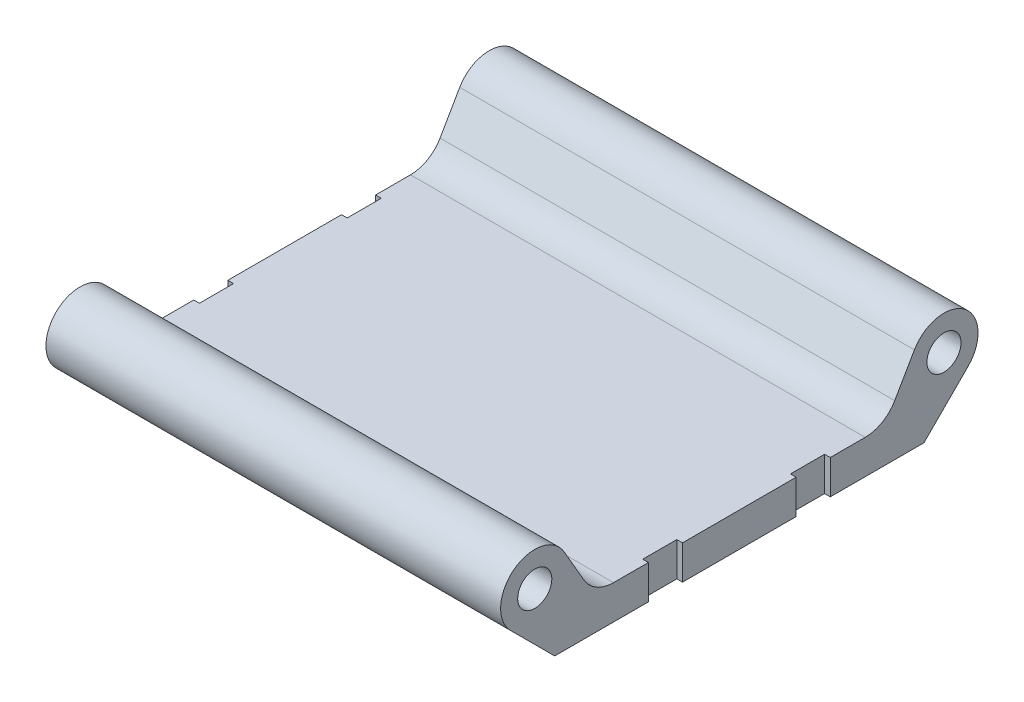
ISO-10303-21;
HEADER;
FILE_DESCRIPTION(('STEP AP214'),'2;1');
FILE_NAME('part.step','',(''),(''),'','','');
FILE_SCHEMA(('AUTOMOTIVE_DESIGN { 1 0 10303 214 1 1 1 1 }'));
ENDSEC;
DATA;
#1=APPLICATION_CONTEXT('core data for automotive mechanical design processes');
#2=APPLICATION_PROTOCOL_DEFINITION('international standard','automotive_design',2000,#1);
#3=PRODUCT_CONTEXT('',#1,'mechanical');
#4=PRODUCT('Part','Part','',(#3));
#5=PRODUCT_RELATED_PRODUCT_CATEGORY('part','',(#4));
#6=PRODUCT_DEFINITION_FORMATION('','',#4);
#7=PRODUCT_DEFINITION_CONTEXT('part definition',#1,'design');
#8=PRODUCT_DEFINITION('design','',#6,#7);
#9=PRODUCT_DEFINITION_SHAPE('','',#8);
#10=(LENGTH_UNIT() NAMED_UNIT(*) SI_UNIT(.MILLI.,.METRE.));
#11=(NAMED_UNIT(*) PLANE_ANGLE_UNIT() SI_UNIT($,.RADIAN.));
#12=(NAMED_UNIT(*) SI_UNIT($,.STERADIAN.) SOLID_ANGLE_UNIT());
#13=UNCERTAINTY_MEASURE_WITH_UNIT(LENGTH_MEASURE(1.E-05),#10,'distance_accuracy_value','');
#14=(GEOMETRIC_REPRESENTATION_CONTEXT(3) GLOBAL_UNCERTAINTY_ASSIGNED_CONTEXT((#13)) GLOBAL_UNIT_ASSIGNED_CONTEXT((#10,
#11,#12)) REPRESENTATION_CONTEXT('',''));
#15=CARTESIAN_POINT('',(0.,0.,0.));
#16=DIRECTION('',(0.,0.,1.));
#17=DIRECTION('',(1.,0.,0.));
#18=AXIS2_PLACEMENT_3D('',#15,#16,#17);
#19=CARTESIAN_POINT('',(40.,3.,12.8038475772933));
#20=DIRECTION('',(0.,-1.,0.));
#21=DIRECTION('',(0.,0.,-1.));
#22=AXIS2_PLACEMENT_3D('',#19,#20,#21);
#23=PLANE('',#22);
#24=DIRECTION('',(-1.,0.,0.));
#25=VECTOR('',#24,1.);
#26=CARTESIAN_POINT('',(40.,3.,8.));
#27=LINE('',#26,#25);
#28=CARTESIAN_POINT('',(40.,3.,8.));
#29=VERTEX_POINT('',#28);
#30=CARTESIAN_POINT('',(39.5,3.,7.99999999999999));
#31=VERTEX_POINT('',#30);
#32=EDGE_CURVE('E206',#29,#31,#27,.T.);
#33=ORIENTED_EDGE('',*,*,#32,.T.);
#34=DIRECTION('',(0.,0.,-1.));
#35=VECTOR('',#34,1.);
#36=CARTESIAN_POINT('',(39.5,3.,7.99999999999999));
#37=LINE('',#36,#35);
#38=CARTESIAN_POINT('',(39.5,3.,4.99999999999999));
#39=VERTEX_POINT('',#38);
#40=EDGE_CURVE('E217',#31,#39,#37,.T.);
#41=ORIENTED_EDGE('',*,*,#40,.T.);
#42=DIRECTION('',(-1.,0.,0.));
#43=VECTOR('',#42,1.);
#44=CARTESIAN_POINT('',(40.,3.,5.));
#45=LINE('',#44,#43);
#46=CARTESIAN_POINT('',(40.,3.,5.));
#47=VERTEX_POINT('',#46);
#48=EDGE_CURVE('E456',#47,#39,#45,.T.);
#49=ORIENTED_EDGE('',*,*,#48,.F.);
#50=DIRECTION('',(0.,0.,1.));
#51=VECTOR('',#50,1.);
#52=CARTESIAN_POINT('',(40.,3.,12.8038475772933));
#53=LINE('',#52,#51);
#54=CARTESIAN_POINT('',(40.,3.,-5.));
#55=VERTEX_POINT('',#54);
#56=EDGE_CURVE('E231',#55,#47,#53,.T.);
#57=ORIENTED_EDGE('',*,*,#56,.F.);
#58=DIRECTION('',(-1.,0.,0.));
#59=VECTOR('',#58,1.);
#60=CARTESIAN_POINT('',(0.,3.,-4.99999999999965));
#61=LINE('',#60,#59);
#62=CARTESIAN_POINT('',(39.5,3.,-4.99999999999999));
#63=VERTEX_POINT('',#62);
#64=EDGE_CURVE('E350',#55,#63,#61,.T.);
#65=ORIENTED_EDGE('',*,*,#64,.T.);
#66=DIRECTION('',(0.,0.,1.));
#67=VECTOR('',#66,1.);
#68=CARTESIAN_POINT('',(39.5,3.,0.));
#69=LINE('',#68,#67);
#70=CARTESIAN_POINT('',(39.5,3.,-7.99999999999999));
#71=VERTEX_POINT('',#70);
#72=EDGE_CURVE('E428',#71,#63,#69,.T.);
#73=ORIENTED_EDGE('',*,*,#72,.F.);
#74=DIRECTION('',(-1.,0.,0.));
#75=VECTOR('',#74,1.);
#76=CARTESIAN_POINT('',(0.,3.,-7.99999999999986));
#77=LINE('',#76,#75);
#78=CARTESIAN_POINT('',(40.,3.,-8.));
#79=VERTEX_POINT('',#78);
#80=EDGE_CURVE('E425',#79,#71,#77,.T.);
#81=ORIENTED_EDGE('',*,*,#80,.F.);
#82=CARTESIAN_POINT('',(40.,3.,-11.0717967697245));
#83=VERTEX_POINT('',#82);
#84=EDGE_CURVE('E234',#83,#79,#53,.T.);
#85=ORIENTED_EDGE('',*,*,#84,.F.);
#86=DIRECTION('',(-1.,0.,0.));
#87=VECTOR('',#86,1.);
#88=CARTESIAN_POINT('',(0.,3.,-11.0717967697245));
#89=LINE('',#88,#87);
#90=CARTESIAN_POINT('',(0.,3.,-11.0717967697245));
#91=VERTEX_POINT('',#90);
#92=EDGE_CURVE('E295',#83,#91,#89,.T.);
#93=ORIENTED_EDGE('',*,*,#92,.T.);
#94=DIRECTION('',(0.,0.,1.));
#95=VECTOR('',#94,1.);
#96=CARTESIAN_POINT('',(0.,3.,12.8038475772933));
#97=LINE('',#96,#95);
#98=CARTESIAN_POINT('',(0.,3.,-7.99999999999999));
#99=VERTEX_POINT('',#98);
#100=EDGE_CURVE('E261',#91,#99,#97,.T.);
#101=ORIENTED_EDGE('',*,*,#100,.T.);
#102=DIRECTION('',(1.,0.,0.));
#103=VECTOR('',#102,1.);
#104=CARTESIAN_POINT('',(0.,3.,-7.99999999999999));
#105=LINE('',#104,#103);
#106=CARTESIAN_POINT('',(0.5,3.,-7.99999999999999));
#107=VERTEX_POINT('',#106);
#108=EDGE_CURVE('E375',#99,#107,#105,.T.);
#109=ORIENTED_EDGE('',*,*,#108,.T.);
#110=DIRECTION('',(0.,0.,1.));
#111=VECTOR('',#110,1.);
#112=CARTESIAN_POINT('',(0.500000000000001,3.,0.));
#113=LINE('',#112,#111);
#114=CARTESIAN_POINT('',(0.500000000000001,3.,-4.99999999999999));
#115=VERTEX_POINT('',#114);
#116=EDGE_CURVE('E359',#107,#115,#113,.T.);
#117=ORIENTED_EDGE('',*,*,#116,.T.);
#118=DIRECTION('',(1.,0.,0.));
#119=VECTOR('',#118,1.);
#120=CARTESIAN_POINT('',(0.,3.,-4.99999999999999));
#121=LINE('',#120,#119);
#122=CARTESIAN_POINT('',(0.,3.,-4.99999999999999));
#123=VERTEX_POINT('',#122);
#124=EDGE_CURVE('E367',#123,#115,#121,.T.);
#125=ORIENTED_EDGE('',*,*,#124,.F.);
#126=CARTESIAN_POINT('',(0.,3.,5.));
#127=VERTEX_POINT('',#126);
#128=EDGE_CURVE('E265',#123,#127,#97,.T.);
#129=ORIENTED_EDGE('',*,*,#128,.T.);
#130=DIRECTION('',(1.,0.,0.));
#131=VECTOR('',#130,1.);
#132=CARTESIAN_POINT('',(0.,3.,5.));
#133=LINE('',#132,#131);
#134=CARTESIAN_POINT('',(0.500000000000007,3.,5.));
#135=VERTEX_POINT('',#134);
#136=EDGE_CURVE('E351',#127,#135,#133,.T.);
#137=ORIENTED_EDGE('',*,*,#136,.T.);
#138=DIRECTION('',(0.,0.,-1.));
#139=VECTOR('',#138,1.);
#140=CARTESIAN_POINT('',(0.500000000000007,3.,0.));
#141=LINE('',#140,#139);
#142=CARTESIAN_POINT('',(0.500000000000007,3.,8.));
#143=VERTEX_POINT('',#142);
#144=EDGE_CURVE('E354',#143,#135,#141,.T.);
#145=ORIENTED_EDGE('',*,*,#144,.F.);
#146=DIRECTION('',(1.,0.,0.));
#147=VECTOR('',#146,1.);
#148=CARTESIAN_POINT('',(0.,3.,8.));
#149=LINE('',#148,#147);
#150=CARTESIAN_POINT('',(0.,3.,8.));
#151=VERTEX_POINT('',#150);
#152=EDGE_CURVE('E358',#151,#143,#149,.T.);
#153=ORIENTED_EDGE('',*,*,#152,.F.);
#154=CARTESIAN_POINT('',(0.,3.,11.0717967697245));
#155=VERTEX_POINT('',#154);
#156=EDGE_CURVE('E260',#151,#155,#97,.T.);
#157=ORIENTED_EDGE('',*,*,#156,.T.);
#158=DIRECTION('',(-1.,0.,0.));
#159=VECTOR('',#158,1.);
#160=CARTESIAN_POINT('',(40.,3.,11.0717967697245));
#161=LINE('',#160,#159);
#162=CARTESIAN_POINT('',(40.,3.,11.0717967697245));
#163=VERTEX_POINT('',#162);
#164=EDGE_CURVE('E229',#155,#163,#161,.F.);
#165=ORIENTED_EDGE('',*,*,#164,.T.);
#166=EDGE_CURVE('E222',#29,#163,#53,.T.);
#167=ORIENTED_EDGE('',*,*,#166,.F.);
#168=EDGE_LOOP('',(#33,#41,#49,#57,#65,#73,#81,#85,#93,#101,#109,#117,#125,#129,#137,#145,#153,
#157,#165,#167));
#169=FACE_BOUND('',#168,.T.);
#170=ADVANCED_FACE('F33',(#169),#23,.F.);
#171=CARTESIAN_POINT('',(40.,0.,16.2426406871193));
#172=DIRECTION('',(0.,1.,0.));
#173=DIRECTION('',(0.,0.,1.));
#174=AXIS2_PLACEMENT_3D('',#171,#172,#173);
#175=PLANE('',#174);
#176=DIRECTION('',(-1.,0.,0.));
#177=VECTOR('',#176,1.);
#178=CARTESIAN_POINT('',(40.,0.,8.));
#179=LINE('',#178,#177);
#180=CARTESIAN_POINT('',(40.,0.,8.));
#181=VERTEX_POINT('',#180);
#182=CARTESIAN_POINT('',(39.5,0.,7.99999999999999));
#183=VERTEX_POINT('',#182);
#184=EDGE_CURVE('E454',#181,#183,#179,.T.);
#185=ORIENTED_EDGE('',*,*,#184,.F.);
#186=DIRECTION('',(0.,0.,-1.));
#187=VECTOR('',#186,1.);
#188=CARTESIAN_POINT('',(40.,0.,-16.2426406871193));
#189=LINE('',#188,#187);
#190=CARTESIAN_POINT('',(40.,0.,16.2426406871193));
#191=VERTEX_POINT('',#190);
#192=EDGE_CURVE('E225',#191,#181,#189,.T.);
#193=ORIENTED_EDGE('',*,*,#192,.F.);
#194=DIRECTION('',(-1.,0.,0.));
#195=VECTOR('',#194,1.);
#196=CARTESIAN_POINT('',(40.,0.,16.2426406871193));
#197=LINE('',#196,#195);
#198=CARTESIAN_POINT('',(0.,0.,16.2426406871193));
#199=VERTEX_POINT('',#198);
#200=EDGE_CURVE('E251',#191,#199,#197,.T.);
#201=ORIENTED_EDGE('',*,*,#200,.T.);
#202=DIRECTION('',(0.,0.,-1.));
#203=VECTOR('',#202,1.);
#204=CARTESIAN_POINT('',(0.,0.,16.2426406871193));
#205=LINE('',#204,#203);
#206=CARTESIAN_POINT('',(0.,0.,8.));
#207=VERTEX_POINT('',#206);
#208=EDGE_CURVE('E272',#199,#207,#205,.T.);
#209=ORIENTED_EDGE('',*,*,#208,.T.);
#210=DIRECTION('',(1.,0.,0.));
#211=VECTOR('',#210,1.);
#212=CARTESIAN_POINT('',(0.,0.,8.));
#213=LINE('',#212,#211);
#214=CARTESIAN_POINT('',(0.500000000000007,0.,8.));
#215=VERTEX_POINT('',#214);
#216=EDGE_CURVE('E355',#207,#215,#213,.T.);
#217=ORIENTED_EDGE('',*,*,#216,.T.);
#218=DIRECTION('',(0.,0.,-1.));
#219=VECTOR('',#218,1.);
#220=CARTESIAN_POINT('',(0.500000000000007,0.,0.));
#221=LINE('',#220,#219);
#222=CARTESIAN_POINT('',(0.500000000000007,0.,5.));
#223=VERTEX_POINT('',#222);
#224=EDGE_CURVE('E338',#215,#223,#221,.T.);
#225=ORIENTED_EDGE('',*,*,#224,.T.);
#226=DIRECTION('',(1.,0.,0.));
#227=VECTOR('',#226,1.);
#228=CARTESIAN_POINT('',(0.,0.,5.));
#229=LINE('',#228,#227);
#230=CARTESIAN_POINT('',(0.,0.,5.));
#231=VERTEX_POINT('',#230);
#232=EDGE_CURVE('E335',#231,#223,#229,.T.);
#233=ORIENTED_EDGE('',*,*,#232,.F.);
#234=CARTESIAN_POINT('',(0.,0.,-4.99999999999999));
#235=VERTEX_POINT('',#234);
#236=EDGE_CURVE('E276',#231,#235,#205,.T.);
#237=ORIENTED_EDGE('',*,*,#236,.T.);
#238=DIRECTION('',(1.,0.,0.));
#239=VECTOR('',#238,1.);
#240=CARTESIAN_POINT('',(0.,0.,-4.99999999999999));
#241=LINE('',#240,#239);
#242=CARTESIAN_POINT('',(0.500000000000001,0.,-4.99999999999999));
#243=VERTEX_POINT('',#242);
#244=EDGE_CURVE('E369',#235,#243,#241,.T.);
#245=ORIENTED_EDGE('',*,*,#244,.T.);
#246=DIRECTION('',(0.,0.,1.));
#247=VECTOR('',#246,1.);
#248=CARTESIAN_POINT('',(0.500000000000001,0.,0.));
#249=LINE('',#248,#247);
#250=CARTESIAN_POINT('',(0.5,0.,-7.99999999999999));
#251=VERTEX_POINT('',#250);
#252=EDGE_CURVE('E364',#251,#243,#249,.T.);
#253=ORIENTED_EDGE('',*,*,#252,.F.);
#254=DIRECTION('',(1.,0.,0.));
#255=VECTOR('',#254,1.);
#256=CARTESIAN_POINT('',(0.,0.,-7.99999999999999));
#257=LINE('',#256,#255);
#258=CARTESIAN_POINT('',(0.,0.,-7.99999999999999));
#259=VERTEX_POINT('',#258);
#260=EDGE_CURVE('E366',#259,#251,#257,.T.);
#261=ORIENTED_EDGE('',*,*,#260,.F.);
#262=CARTESIAN_POINT('',(0.,0.,-16.2426406871193));
#263=VERTEX_POINT('',#262);
#264=EDGE_CURVE('E271',#259,#263,#205,.T.);
#265=ORIENTED_EDGE('',*,*,#264,.T.);
#266=DIRECTION('',(-1.,0.,0.));
#267=VECTOR('',#266,1.);
#268=CARTESIAN_POINT('',(40.,0.,-16.2426406871193));
#269=LINE('',#268,#267);
#270=CARTESIAN_POINT('',(40.,0.,-16.2426406871193));
#271=VERTEX_POINT('',#270);
#272=EDGE_CURVE('E291',#271,#263,#269,.T.);
#273=ORIENTED_EDGE('',*,*,#272,.F.);
#274=CARTESIAN_POINT('',(40.,0.,-8.));
#275=VERTEX_POINT('',#274);
#276=EDGE_CURVE('E275',#275,#271,#189,.T.);
#277=ORIENTED_EDGE('',*,*,#276,.F.);
#278=DIRECTION('',(-1.,0.,0.));
#279=VECTOR('',#278,1.);
#280=CARTESIAN_POINT('',(0.,0.,-7.99999999999986));
#281=LINE('',#280,#279);
#282=CARTESIAN_POINT('',(39.5,0.,-7.99999999999999));
#283=VERTEX_POINT('',#282);
#284=EDGE_CURVE('E56',#275,#283,#281,.T.);
#285=ORIENTED_EDGE('',*,*,#284,.T.);
#286=DIRECTION('',(0.,0.,1.));
#287=VECTOR('',#286,1.);
#288=CARTESIAN_POINT('',(39.5,0.,0.));
#289=LINE('',#288,#287);
#290=CARTESIAN_POINT('',(39.5,0.,-4.99999999999999));
#291=VERTEX_POINT('',#290);
#292=EDGE_CURVE('E434',#283,#291,#289,.T.);
#293=ORIENTED_EDGE('',*,*,#292,.T.);
#294=DIRECTION('',(-1.,0.,0.));
#295=VECTOR('',#294,1.);
#296=CARTESIAN_POINT('',(0.,0.,-4.99999999999965));
#297=LINE('',#296,#295);
#298=CARTESIAN_POINT('',(40.,0.,-5.));
#299=VERTEX_POINT('',#298);
#300=EDGE_CURVE('E343',#299,#291,#297,.T.);
#301=ORIENTED_EDGE('',*,*,#300,.F.);
#302=CARTESIAN_POINT('',(40.,0.,4.99999999999999));
#303=VERTEX_POINT('',#302);
#304=EDGE_CURVE('E401',#303,#299,#189,.T.);
#305=ORIENTED_EDGE('',*,*,#304,.F.);
#306=DIRECTION('',(-1.,0.,0.));
#307=VECTOR('',#306,1.);
#308=CARTESIAN_POINT('',(40.,0.,5.));
#309=LINE('',#308,#307);
#310=CARTESIAN_POINT('',(39.5,0.,4.99999999999999));
#311=VERTEX_POINT('',#310);
#312=EDGE_CURVE('E48',#303,#311,#309,.T.);
#313=ORIENTED_EDGE('',*,*,#312,.T.);
#314=DIRECTION('',(0.,0.,-1.));
#315=VECTOR('',#314,1.);
#316=CARTESIAN_POINT('',(39.5,0.,7.99999999999999));
#317=LINE('',#316,#315);
#318=EDGE_CURVE('E457',#183,#311,#317,.T.);
#319=ORIENTED_EDGE('',*,*,#318,.F.);
#320=EDGE_LOOP('',(#185,#193,#201,#209,#217,#225,#233,#237,#245,#253,#261,#265,#273,#277,#285,
#293,#301,#305,#313,#319));
#321=FACE_BOUND('',#320,.T.);
#322=ADVANCED_FACE('F329',(#321),#175,.F.);
#323=CARTESIAN_POINT('',(40.,6.,18.));
#324=DIRECTION('',(1.,0.,0.));
#325=DIRECTION('',(0.,0.,-1.));
#326=AXIS2_PLACEMENT_3D('',#323,#324,#325);
#327=PLANE('',#326);
#328=CARTESIAN_POINT('',(40.,6.,18.));
#329=DIRECTION('',(1.,0.,0.));
#330=DIRECTION('',(0.,0.,1.));
#331=AXIS2_PLACEMENT_3D('',#328,#329,#330);
#332=CIRCLE('',#331,1.5);
#333=CARTESIAN_POINT('',(40.,6.,19.5));
#334=VERTEX_POINT('',#333);
#335=EDGE_CURVE('E389',#334,#334,#332,.T.);
#336=ORIENTED_EDGE('',*,*,#335,.F.);
#337=EDGE_LOOP('',(#336));
#338=FACE_BOUND('',#337,.T.);
#339=ORIENTED_EDGE('',*,*,#192,.T.);
#340=DIRECTION('',(0.,1.,0.));
#341=VECTOR('',#340,1.);
#342=CARTESIAN_POINT('',(40.,0.,8.));
#343=LINE('',#342,#341);
#344=EDGE_CURVE('E209',#181,#29,#343,.T.);
#345=ORIENTED_EDGE('',*,*,#344,.T.);
#346=ORIENTED_EDGE('',*,*,#166,.T.);
#347=CARTESIAN_POINT('',(40.,6.,11.0717967697245));
#348=DIRECTION('',(1.,0.,0.));
#349=DIRECTION('',(0.,0.,-1.));
#350=AXIS2_PLACEMENT_3D('',#347,#348,#349);
#351=CIRCLE('',#350,3.);
#352=CARTESIAN_POINT('',(40.,4.49999999999999,13.6698729810778));
#353=VERTEX_POINT('',#352);
#354=EDGE_CURVE('E11',#163,#353,#351,.F.);
#355=ORIENTED_EDGE('',*,*,#354,.T.);
#356=DIRECTION('',(0.,0.866025403784436,0.500000000000005));
#357=VECTOR('',#356,1.);
#358=CARTESIAN_POINT('',(40.,7.50000000000001,15.4019237886467));
#359=LINE('',#358,#357);
#360=CARTESIAN_POINT('',(40.,7.50000000000001,15.4019237886467));
#361=VERTEX_POINT('',#360);
#362=EDGE_CURVE('E241',#353,#361,#359,.T.);
#363=ORIENTED_EDGE('',*,*,#362,.T.);
#364=CARTESIAN_POINT('',(40.,6.,18.));
#365=DIRECTION('',(1.,0.,0.));
#366=DIRECTION('',(0.,0.,-1.));
#367=AXIS2_PLACEMENT_3D('',#364,#365,#366);
#368=CIRCLE('',#367,3.);
#369=CARTESIAN_POINT('',(40.,3.87867965644037,20.1213203435596));
#370=VERTEX_POINT('',#369);
#371=EDGE_CURVE('E244',#361,#370,#368,.T.);
#372=ORIENTED_EDGE('',*,*,#371,.T.);
#373=DIRECTION('',(0.,-0.707106781186549,-0.707106781186546));
#374=VECTOR('',#373,1.);
#375=CARTESIAN_POINT('',(40.,3.87867965644037,20.1213203435596));
#376=LINE('',#375,#374);
#377=EDGE_CURVE('E247',#370,#191,#376,.T.);
#378=ORIENTED_EDGE('',*,*,#377,.T.);
#379=EDGE_LOOP('',(#339,#345,#346,#355,#363,#372,#378));
#380=FACE_BOUND('',#379,.T.);
#381=ADVANCED_FACE('F221',(#338,#380),#327,.T.);
#382=DIRECTION('',(0.,1.,0.));
#383=VECTOR('',#382,1.);
#384=CARTESIAN_POINT('',(40.,0.,5.));
#385=LINE('',#384,#383);
#386=EDGE_CURVE('E226',#303,#47,#385,.T.);
#387=ORIENTED_EDGE('',*,*,#386,.F.);
#388=ORIENTED_EDGE('',*,*,#304,.T.);
#389=DIRECTION('',(0.,1.,0.));
#390=VECTOR('',#389,1.);
#391=CARTESIAN_POINT('',(40.,0.,-5.));
#392=LINE('',#391,#390);
#393=EDGE_CURVE('E436',#299,#55,#392,.T.);
#394=ORIENTED_EDGE('',*,*,#393,.T.);
#395=ORIENTED_EDGE('',*,*,#56,.T.);
#396=EDGE_LOOP('',(#387,#388,#394,#395));
#397=FACE_BOUND('',#396,.T.);
#398=ADVANCED_FACE('F473',(#397),#327,.T.);
#399=CARTESIAN_POINT('',(0.,6.,18.));
#400=DIRECTION('',(1.,0.,0.));
#401=DIRECTION('',(0.,0.,-1.));
#402=AXIS2_PLACEMENT_3D('',#399,#400,#401);
#403=PLANE('',#402);
#404=DIRECTION('',(0.,1.,0.));
#405=VECTOR('',#404,1.);
#406=CARTESIAN_POINT('',(0.,0.,5.));
#407=LINE('',#406,#405);
#408=EDGE_CURVE('E347',#231,#127,#407,.T.);
#409=ORIENTED_EDGE('',*,*,#408,.T.);
#410=ORIENTED_EDGE('',*,*,#128,.F.);
#411=DIRECTION('',(0.,1.,0.));
#412=VECTOR('',#411,1.);
#413=CARTESIAN_POINT('',(0.,0.,-4.99999999999999));
#414=LINE('',#413,#412);
#415=EDGE_CURVE('E383',#235,#123,#414,.T.);
#416=ORIENTED_EDGE('',*,*,#415,.F.);
#417=ORIENTED_EDGE('',*,*,#236,.F.);
#418=EDGE_LOOP('',(#409,#410,#416,#417));
#419=FACE_BOUND('',#418,.T.);
#420=ADVANCED_FACE('F498',(#419),#403,.F.);
#421=CARTESIAN_POINT('',(0.,6.,-18.));
#422=DIRECTION('',(1.,0.,0.));
#423=DIRECTION('',(0.,0.,-1.));
#424=AXIS2_PLACEMENT_3D('',#421,#422,#423);
#425=CIRCLE('',#424,1.5);
#426=CARTESIAN_POINT('',(0.,6.,-19.5));
#427=VERTEX_POINT('',#426);
#428=EDGE_CURVE('E392',#427,#427,#425,.T.);
#429=ORIENTED_EDGE('',*,*,#428,.T.);
#430=EDGE_LOOP('',(#429));
#431=FACE_BOUND('',#430,.T.);
#432=DIRECTION('',(0.,1.,0.));
#433=VECTOR('',#432,1.);
#434=CARTESIAN_POINT('',(0.,0.,-7.99999999999999));
#435=LINE('',#434,#433);
#436=EDGE_CURVE('E385',#259,#99,#435,.T.);
#437=ORIENTED_EDGE('',*,*,#436,.T.);
#438=ORIENTED_EDGE('',*,*,#100,.F.);
#439=CARTESIAN_POINT('',(0.,6.,-11.0717967697245));
#440=DIRECTION('',(1.,0.,0.));
#441=DIRECTION('',(0.,0.,-1.));
#442=AXIS2_PLACEMENT_3D('',#439,#440,#441);
#443=CIRCLE('',#442,3.);
#444=CARTESIAN_POINT('',(0.,4.49999999999999,-13.6698729810778));
#445=VERTEX_POINT('',#444);
#446=EDGE_CURVE('E303',#91,#445,#443,.T.);
#447=ORIENTED_EDGE('',*,*,#446,.T.);
#448=DIRECTION('',(0.,-0.866025403784436,0.500000000000005));
#449=VECTOR('',#448,1.);
#450=CARTESIAN_POINT('',(0.,7.50000000000001,-15.4019237886467));
#451=LINE('',#450,#449);
#452=CARTESIAN_POINT('',(0.,7.50000000000001,-15.4019237886467));
#453=VERTEX_POINT('',#452);
#454=EDGE_CURVE('E257',#453,#445,#451,.T.);
#455=ORIENTED_EDGE('',*,*,#454,.F.);
#456=CARTESIAN_POINT('',(0.,6.,-18.));
#457=DIRECTION('',(1.,0.,0.));
#458=DIRECTION('',(0.,0.,1.));
#459=AXIS2_PLACEMENT_3D('',#456,#457,#458);
#460=CIRCLE('',#459,3.);
#461=CARTESIAN_POINT('',(0.,3.87867965644036,-20.1213203435596));
#462=VERTEX_POINT('',#461);
#463=EDGE_CURVE('E254',#462,#453,#460,.T.);
#464=ORIENTED_EDGE('',*,*,#463,.F.);
#465=DIRECTION('',(0.,0.707106781186549,-0.707106781186546));
#466=VECTOR('',#465,1.);
#467=CARTESIAN_POINT('',(0.,3.87867965644037,-20.1213203435596));
#468=LINE('',#467,#466);
#469=EDGE_CURVE('E252',#263,#462,#468,.T.);
#470=ORIENTED_EDGE('',*,*,#469,.F.);
#471=ORIENTED_EDGE('',*,*,#264,.F.);
#472=EDGE_LOOP('',(#437,#438,#447,#455,#464,#470,#471));
#473=FACE_BOUND('',#472,.T.);
#474=ADVANCED_FACE('F482',(#431,#473),#403,.F.);
#475=DIRECTION('',(0.,1.,0.));
#476=VECTOR('',#475,1.);
#477=CARTESIAN_POINT('',(40.,0.,-8.));
#478=LINE('',#477,#476);
#479=EDGE_CURVE('E449',#275,#79,#478,.T.);
#480=ORIENTED_EDGE('',*,*,#479,.F.);
#481=ORIENTED_EDGE('',*,*,#276,.T.);
#482=DIRECTION('',(0.,0.707106781186549,-0.707106781186546));
#483=VECTOR('',#482,1.);
#484=CARTESIAN_POINT('',(40.,3.87867965644037,-20.1213203435596));
#485=LINE('',#484,#483);
#486=CARTESIAN_POINT('',(40.,3.87867965644036,-20.1213203435596));
#487=VERTEX_POINT('',#486);
#488=EDGE_CURVE('E400',#271,#487,#485,.T.);
#489=ORIENTED_EDGE('',*,*,#488,.T.);
#490=CARTESIAN_POINT('',(40.,6.,-18.));
#491=DIRECTION('',(1.,0.,0.));
#492=DIRECTION('',(0.,0.,1.));
#493=AXIS2_PLACEMENT_3D('',#490,#491,#492);
#494=CIRCLE('',#493,3.);
#495=CARTESIAN_POINT('',(40.,7.50000000000001,-15.4019237886467));
#496=VERTEX_POINT('',#495);
#497=EDGE_CURVE('E237',#487,#496,#494,.T.);
#498=ORIENTED_EDGE('',*,*,#497,.T.);
#499=DIRECTION('',(0.,-0.866025403784436,0.500000000000005));
#500=VECTOR('',#499,1.);
#501=CARTESIAN_POINT('',(40.,7.50000000000001,-15.4019237886467));
#502=LINE('',#501,#500);
#503=CARTESIAN_POINT('',(40.,4.49999999999999,-13.6698729810778));
#504=VERTEX_POINT('',#503);
#505=EDGE_CURVE('E232',#496,#504,#502,.T.);
#506=ORIENTED_EDGE('',*,*,#505,.T.);
#507=CARTESIAN_POINT('',(40.,6.,-11.0717967697245));
#508=DIRECTION('',(1.,0.,0.));
#509=DIRECTION('',(0.,0.,-1.));
#510=AXIS2_PLACEMENT_3D('',#507,#508,#509);
#511=CIRCLE('',#510,3.);
#512=EDGE_CURVE('E305',#504,#83,#511,.F.);
#513=ORIENTED_EDGE('',*,*,#512,.T.);
#514=ORIENTED_EDGE('',*,*,#84,.T.);
#515=EDGE_LOOP('',(#480,#481,#489,#498,#506,#513,#514));
#516=FACE_BOUND('',#515,.T.);
#517=CARTESIAN_POINT('',(40.,6.,-18.));
#518=DIRECTION('',(1.,0.,0.));
#519=DIRECTION('',(0.,0.,-1.));
#520=AXIS2_PLACEMENT_3D('',#517,#518,#519);
#521=CIRCLE('',#520,1.5);
#522=CARTESIAN_POINT('',(40.,6.,-19.5));
#523=VERTEX_POINT('',#522);
#524=EDGE_CURVE('E255',#523,#523,#521,.T.);
#525=ORIENTED_EDGE('',*,*,#524,.F.);
#526=EDGE_LOOP('',(#525));
#527=FACE_BOUND('',#526,.T.);
#528=ADVANCED_FACE('F405',(#516,#527),#327,.T.);
#529=ORIENTED_EDGE('',*,*,#156,.F.);
#530=DIRECTION('',(0.,1.,0.));
#531=VECTOR('',#530,1.);
#532=CARTESIAN_POINT('',(0.,0.,8.));
#533=LINE('',#532,#531);
#534=EDGE_CURVE('E331',#207,#151,#533,.T.);
#535=ORIENTED_EDGE('',*,*,#534,.F.);
#536=ORIENTED_EDGE('',*,*,#208,.F.);
#537=DIRECTION('',(0.,-0.707106781186549,-0.707106781186546));
#538=VECTOR('',#537,1.);
#539=CARTESIAN_POINT('',(0.,3.87867965644037,20.1213203435596));
#540=LINE('',#539,#538);
#541=CARTESIAN_POINT('',(0.,3.87867965644037,20.1213203435596));
#542=VERTEX_POINT('',#541);
#543=EDGE_CURVE('E269',#542,#199,#540,.T.);
#544=ORIENTED_EDGE('',*,*,#543,.F.);
#545=CARTESIAN_POINT('',(0.,6.,18.));
#546=DIRECTION('',(1.,0.,0.));
#547=DIRECTION('',(0.,0.,-1.));
#548=AXIS2_PLACEMENT_3D('',#545,#546,#547);
#549=CIRCLE('',#548,3.);
#550=CARTESIAN_POINT('',(0.,7.50000000000001,15.4019237886467));
#551=VERTEX_POINT('',#550);
#552=EDGE_CURVE('E267',#551,#542,#549,.T.);
#553=ORIENTED_EDGE('',*,*,#552,.F.);
#554=DIRECTION('',(0.,0.866025403784436,0.500000000000005));
#555=VECTOR('',#554,1.);
#556=CARTESIAN_POINT('',(0.,7.50000000000001,15.4019237886467));
#557=LINE('',#556,#555);
#558=CARTESIAN_POINT('',(0.,4.49999999999999,13.6698729810778));
#559=VERTEX_POINT('',#558);
#560=EDGE_CURVE('E264',#559,#551,#557,.T.);
#561=ORIENTED_EDGE('',*,*,#560,.F.);
#562=CARTESIAN_POINT('',(0.,6.,11.0717967697245));
#563=DIRECTION('',(1.,0.,0.));
#564=DIRECTION('',(0.,0.,-1.));
#565=AXIS2_PLACEMENT_3D('',#562,#563,#564);
#566=CIRCLE('',#565,3.);
#567=EDGE_CURVE('E41',#559,#155,#566,.T.);
#568=ORIENTED_EDGE('',*,*,#567,.T.);
#569=EDGE_LOOP('',(#529,#535,#536,#544,#553,#561,#568));
#570=FACE_BOUND('',#569,.T.);
#571=CARTESIAN_POINT('',(0.,6.,18.));
#572=DIRECTION('',(1.,0.,0.));
#573=DIRECTION('',(0.,0.,1.));
#574=AXIS2_PLACEMENT_3D('',#571,#572,#573);
#575=CIRCLE('',#574,1.5);
#576=CARTESIAN_POINT('',(0.,6.,19.5));
#577=VERTEX_POINT('',#576);
#578=EDGE_CURVE('E382',#577,#577,#575,.T.);
#579=ORIENTED_EDGE('',*,*,#578,.T.);
#580=EDGE_LOOP('',(#579));
#581=FACE_BOUND('',#580,.T.);
#582=ADVANCED_FACE('F310',(#570,#581),#403,.F.);
#583=CARTESIAN_POINT('',(40.,3.87867965644037,-20.1213203435596));
#584=DIRECTION('',(0.,0.707106781186546,0.707106781186549));
#585=DIRECTION('',(0.,-0.707106781186549,0.707106781186546));
#586=AXIS2_PLACEMENT_3D('',#583,#584,#585);
#587=PLANE('',#586);
#588=ORIENTED_EDGE('',*,*,#469,.T.);
#589=DIRECTION('',(-1.,0.,0.));
#590=VECTOR('',#589,1.);
#591=CARTESIAN_POINT('',(40.,3.87867965644036,-20.1213203435596));
#592=LINE('',#591,#590);
#593=EDGE_CURVE('E288',#487,#462,#592,.T.);
#594=ORIENTED_EDGE('',*,*,#593,.F.);
#595=ORIENTED_EDGE('',*,*,#488,.F.);
#596=ORIENTED_EDGE('',*,*,#272,.T.);
#597=EDGE_LOOP('',(#588,#594,#595,#596));
#598=FACE_BOUND('',#597,.T.);
#599=ADVANCED_FACE('F476',(#598),#587,.F.);
#600=CARTESIAN_POINT('',(40.,6.,-18.));
#601=DIRECTION('',(-1.,0.,0.));
#602=DIRECTION('',(0.,0.,1.));
#603=AXIS2_PLACEMENT_3D('',#600,#601,#602);
#604=CYLINDRICAL_SURFACE('',#603,3.);
#605=ORIENTED_EDGE('',*,*,#463,.T.);
#606=DIRECTION('',(-1.,0.,0.));
#607=VECTOR('',#606,1.);
#608=CARTESIAN_POINT('',(40.,7.50000000000001,-15.4019237886467));
#609=LINE('',#608,#607);
#610=EDGE_CURVE('E285',#496,#453,#609,.T.);
#611=ORIENTED_EDGE('',*,*,#610,.F.);
#612=ORIENTED_EDGE('',*,*,#497,.F.);
#613=ORIENTED_EDGE('',*,*,#593,.T.);
#614=EDGE_LOOP('',(#605,#611,#612,#613));
#615=FACE_BOUND('',#614,.T.);
#616=ADVANCED_FACE('F412',(#615),#604,.T.);
#617=CARTESIAN_POINT('',(40.,7.50000000000001,-15.4019237886467));
#618=DIRECTION('',(0.,-0.500000000000005,-0.866025403784436));
#619=DIRECTION('',(0.,0.866025403784436,-0.500000000000005));
#620=AXIS2_PLACEMENT_3D('',#617,#618,#619);
#621=PLANE('',#620);
#622=ORIENTED_EDGE('',*,*,#454,.T.);
#623=DIRECTION('',(-1.,0.,0.));
#624=VECTOR('',#623,1.);
#625=CARTESIAN_POINT('',(40.,4.49999999999999,-13.6698729810778));
#626=LINE('',#625,#624);
#627=EDGE_CURVE('E298',#445,#504,#626,.F.);
#628=ORIENTED_EDGE('',*,*,#627,.T.);
#629=ORIENTED_EDGE('',*,*,#505,.F.);
#630=ORIENTED_EDGE('',*,*,#610,.T.);
#631=EDGE_LOOP('',(#622,#628,#629,#630));
#632=FACE_BOUND('',#631,.T.);
#633=ADVANCED_FACE('F416',(#632),#621,.F.);
#634=CARTESIAN_POINT('',(40.,7.50000000000001,15.4019237886467));
#635=DIRECTION('',(0.,-0.500000000000005,0.866025403784436));
#636=DIRECTION('',(0.,-0.866025403784436,-0.500000000000005));
#637=AXIS2_PLACEMENT_3D('',#634,#635,#636);
#638=PLANE('',#637);
#639=ORIENTED_EDGE('',*,*,#362,.F.);
#640=DIRECTION('',(-1.,0.,0.));
#641=VECTOR('',#640,1.);
#642=CARTESIAN_POINT('',(0.,4.49999999999999,13.6698729810778));
#643=LINE('',#642,#641);
#644=EDGE_CURVE('E300',#353,#559,#643,.T.);
#645=ORIENTED_EDGE('',*,*,#644,.T.);
#646=ORIENTED_EDGE('',*,*,#560,.T.);
#647=DIRECTION('',(-1.,0.,0.));
#648=VECTOR('',#647,1.);
#649=CARTESIAN_POINT('',(40.,7.50000000000001,15.4019237886467));
#650=LINE('',#649,#648);
#651=EDGE_CURVE('E282',#361,#551,#650,.T.);
#652=ORIENTED_EDGE('',*,*,#651,.F.);
#653=EDGE_LOOP('',(#639,#645,#646,#652));
#654=FACE_BOUND('',#653,.T.);
#655=ADVANCED_FACE('F317',(#654),#638,.F.);
#656=CARTESIAN_POINT('',(40.,6.,18.));
#657=DIRECTION('',(-1.,0.,0.));
#658=DIRECTION('',(0.,0.,1.));
#659=AXIS2_PLACEMENT_3D('',#656,#657,#658);
#660=CYLINDRICAL_SURFACE('',#659,3.);
#661=ORIENTED_EDGE('',*,*,#552,.T.);
#662=DIRECTION('',(-1.,0.,0.));
#663=VECTOR('',#662,1.);
#664=CARTESIAN_POINT('',(40.,3.87867965644037,20.1213203435596));
#665=LINE('',#664,#663);
#666=EDGE_CURVE('E279',#370,#542,#665,.T.);
#667=ORIENTED_EDGE('',*,*,#666,.F.);
#668=ORIENTED_EDGE('',*,*,#371,.F.);
#669=ORIENTED_EDGE('',*,*,#651,.T.);
#670=EDGE_LOOP('',(#661,#667,#668,#669));
#671=FACE_BOUND('',#670,.T.);
#672=ADVANCED_FACE('F321',(#671),#660,.T.);
#673=CARTESIAN_POINT('',(40.,3.87867965644037,20.1213203435596));
#674=DIRECTION('',(0.,0.707106781186546,-0.707106781186549));
#675=DIRECTION('',(0.,0.707106781186549,0.707106781186546));
#676=AXIS2_PLACEMENT_3D('',#673,#674,#675);
#677=PLANE('',#676);
#678=ORIENTED_EDGE('',*,*,#543,.T.);
#679=ORIENTED_EDGE('',*,*,#200,.F.);
#680=ORIENTED_EDGE('',*,*,#377,.F.);
#681=ORIENTED_EDGE('',*,*,#666,.T.);
#682=EDGE_LOOP('',(#678,#679,#680,#681));
#683=FACE_BOUND('',#682,.T.);
#684=ADVANCED_FACE('F325',(#683),#677,.F.);
#685=CARTESIAN_POINT('',(40.,6.,-18.));
#686=DIRECTION('',(-1.,0.,0.));
#687=DIRECTION('',(0.,0.,1.));
#688=AXIS2_PLACEMENT_3D('',#685,#686,#687);
#689=CYLINDRICAL_SURFACE('',#688,1.5);
#690=ORIENTED_EDGE('',*,*,#524,.T.);
#691=EDGE_LOOP('',(#690));
#692=FACE_BOUND('',#691,.T.);
#693=ORIENTED_EDGE('',*,*,#428,.F.);
#694=EDGE_LOOP('',(#693));
#695=FACE_BOUND('',#694,.T.);
#696=ADVANCED_FACE('F539',(#692,#695),#689,.F.);
#697=CARTESIAN_POINT('',(40.,6.,18.));
#698=DIRECTION('',(-1.,0.,0.));
#699=DIRECTION('',(0.,0.,1.));
#700=AXIS2_PLACEMENT_3D('',#697,#698,#699);
#701=CYLINDRICAL_SURFACE('',#700,1.5);
#702=ORIENTED_EDGE('',*,*,#335,.T.);
#703=EDGE_LOOP('',(#702));
#704=FACE_BOUND('',#703,.T.);
#705=ORIENTED_EDGE('',*,*,#578,.F.);
#706=EDGE_LOOP('',(#705));
#707=FACE_BOUND('',#706,.T.);
#708=ADVANCED_FACE('F534',(#704,#707),#701,.F.);
#709=CARTESIAN_POINT('',(40.,6.,-11.0717967697245));
#710=DIRECTION('',(1.,0.,0.));
#711=DIRECTION('',(0.,0.,-1.));
#712=AXIS2_PLACEMENT_3D('',#709,#710,#711);
#713=CYLINDRICAL_SURFACE('',#712,3.);
#714=ORIENTED_EDGE('',*,*,#512,.F.);
#715=ORIENTED_EDGE('',*,*,#627,.F.);
#716=ORIENTED_EDGE('',*,*,#446,.F.);
#717=ORIENTED_EDGE('',*,*,#92,.F.);
#718=EDGE_LOOP('',(#714,#715,#716,#717));
#719=FACE_BOUND('',#718,.T.);
#720=ADVANCED_FACE('F419',(#719),#713,.F.);
#721=CARTESIAN_POINT('',(40.,6.,11.0717967697245));
#722=DIRECTION('',(1.,0.,0.));
#723=DIRECTION('',(0.,0.,-1.));
#724=AXIS2_PLACEMENT_3D('',#721,#722,#723);
#725=CYLINDRICAL_SURFACE('',#724,3.);
#726=ORIENTED_EDGE('',*,*,#354,.F.);
#727=ORIENTED_EDGE('',*,*,#164,.F.);
#728=ORIENTED_EDGE('',*,*,#567,.F.);
#729=ORIENTED_EDGE('',*,*,#644,.F.);
#730=EDGE_LOOP('',(#726,#727,#728,#729));
#731=FACE_BOUND('',#730,.T.);
#732=ADVANCED_FACE('F35',(#731),#725,.F.);
#733=CARTESIAN_POINT('',(0.500000000000001,0.,0.));
#734=DIRECTION('',(-1.,0.,0.));
#735=DIRECTION('',(0.,0.,1.));
#736=AXIS2_PLACEMENT_3D('',#733,#734,#735);
#737=PLANE('',#736);
#738=ORIENTED_EDGE('',*,*,#116,.F.);
#739=DIRECTION('',(0.,1.,0.));
#740=VECTOR('',#739,1.);
#741=CARTESIAN_POINT('',(0.5,0.,-7.99999999999999));
#742=LINE('',#741,#740);
#743=EDGE_CURVE('E372',#251,#107,#742,.T.);
#744=ORIENTED_EDGE('',*,*,#743,.F.);
#745=ORIENTED_EDGE('',*,*,#252,.T.);
#746=DIRECTION('',(0.,1.,0.));
#747=VECTOR('',#746,1.);
#748=CARTESIAN_POINT('',(0.500000000000001,0.,-4.99999999999999));
#749=LINE('',#748,#747);
#750=EDGE_CURVE('E380',#243,#115,#749,.T.);
#751=ORIENTED_EDGE('',*,*,#750,.T.);
#752=EDGE_LOOP('',(#738,#744,#745,#751));
#753=FACE_BOUND('',#752,.T.);
#754=ADVANCED_FACE('F489',(#753),#737,.T.);
#755=CARTESIAN_POINT('',(0.,0.,-4.99999999999999));
#756=DIRECTION('',(0.,0.,1.));
#757=DIRECTION('',(1.,0.,0.));
#758=AXIS2_PLACEMENT_3D('',#755,#756,#757);
#759=PLANE('',#758);
#760=ORIENTED_EDGE('',*,*,#124,.T.);
#761=ORIENTED_EDGE('',*,*,#750,.F.);
#762=ORIENTED_EDGE('',*,*,#244,.F.);
#763=ORIENTED_EDGE('',*,*,#415,.T.);
#764=EDGE_LOOP('',(#760,#761,#762,#763));
#765=FACE_BOUND('',#764,.T.);
#766=ADVANCED_FACE('F493',(#765),#759,.F.);
#767=CARTESIAN_POINT('',(0.,0.,-7.99999999999999));
#768=DIRECTION('',(0.,0.,1.));
#769=DIRECTION('',(1.,0.,0.));
#770=AXIS2_PLACEMENT_3D('',#767,#768,#769);
#771=PLANE('',#770);
#772=ORIENTED_EDGE('',*,*,#108,.F.);
#773=ORIENTED_EDGE('',*,*,#436,.F.);
#774=ORIENTED_EDGE('',*,*,#260,.T.);
#775=ORIENTED_EDGE('',*,*,#743,.T.);
#776=EDGE_LOOP('',(#772,#773,#774,#775));
#777=FACE_BOUND('',#776,.T.);
#778=ADVANCED_FACE('F486',(#777),#771,.T.);
#779=CARTESIAN_POINT('',(0.,0.,5.));
#780=DIRECTION('',(0.,0.,1.));
#781=DIRECTION('',(1.,0.,0.));
#782=AXIS2_PLACEMENT_3D('',#779,#780,#781);
#783=PLANE('',#782);
#784=ORIENTED_EDGE('',*,*,#136,.F.);
#785=ORIENTED_EDGE('',*,*,#408,.F.);
#786=ORIENTED_EDGE('',*,*,#232,.T.);
#787=DIRECTION('',(0.,1.,0.));
#788=VECTOR('',#787,1.);
#789=CARTESIAN_POINT('',(0.500000000000007,0.,5.));
#790=LINE('',#789,#788);
#791=EDGE_CURVE('E340',#223,#135,#790,.T.);
#792=ORIENTED_EDGE('',*,*,#791,.T.);
#793=EDGE_LOOP('',(#784,#785,#786,#792));
#794=FACE_BOUND('',#793,.T.);
#795=ADVANCED_FACE('F508',(#794),#783,.T.);
#796=CARTESIAN_POINT('',(0.500000000000007,0.,0.));
#797=DIRECTION('',(1.,0.,0.));
#798=DIRECTION('',(0.,0.,-1.));
#799=AXIS2_PLACEMENT_3D('',#796,#797,#798);
#800=PLANE('',#799);
#801=ORIENTED_EDGE('',*,*,#144,.T.);
#802=ORIENTED_EDGE('',*,*,#791,.F.);
#803=ORIENTED_EDGE('',*,*,#224,.F.);
#804=DIRECTION('',(0.,1.,0.));
#805=VECTOR('',#804,1.);
#806=CARTESIAN_POINT('',(0.500000000000007,0.,8.));
#807=LINE('',#806,#805);
#808=EDGE_CURVE('E336',#215,#143,#807,.T.);
#809=ORIENTED_EDGE('',*,*,#808,.T.);
#810=EDGE_LOOP('',(#801,#802,#803,#809));
#811=FACE_BOUND('',#810,.T.);
#812=ADVANCED_FACE('F506',(#811),#800,.F.);
#813=CARTESIAN_POINT('',(0.,0.,8.));
#814=DIRECTION('',(0.,0.,1.));
#815=DIRECTION('',(1.,0.,0.));
#816=AXIS2_PLACEMENT_3D('',#813,#814,#815);
#817=PLANE('',#816);
#818=ORIENTED_EDGE('',*,*,#152,.T.);
#819=ORIENTED_EDGE('',*,*,#808,.F.);
#820=ORIENTED_EDGE('',*,*,#216,.F.);
#821=ORIENTED_EDGE('',*,*,#534,.T.);
#822=EDGE_LOOP('',(#818,#819,#820,#821));
#823=FACE_BOUND('',#822,.T.);
#824=ADVANCED_FACE('F502',(#823),#817,.F.);
#825=CARTESIAN_POINT('',(0.,0.,-4.99999999999965));
#826=DIRECTION('',(0.,0.,-1.));
#827=DIRECTION('',(-1.,0.,0.));
#828=AXIS2_PLACEMENT_3D('',#825,#826,#827);
#829=PLANE('',#828);
#830=ORIENTED_EDGE('',*,*,#64,.F.);
#831=ORIENTED_EDGE('',*,*,#393,.F.);
#832=ORIENTED_EDGE('',*,*,#300,.T.);
#833=DIRECTION('',(0.,1.,0.));
#834=VECTOR('',#833,1.);
#835=CARTESIAN_POINT('',(39.5,0.,-4.99999999999999));
#836=LINE('',#835,#834);
#837=EDGE_CURVE('E216',#291,#63,#836,.T.);
#838=ORIENTED_EDGE('',*,*,#837,.T.);
#839=EDGE_LOOP('',(#830,#831,#832,#838));
#840=FACE_BOUND('',#839,.T.);
#841=ADVANCED_FACE('F442',(#840),#829,.T.);
#842=CARTESIAN_POINT('',(39.5,0.,0.));
#843=DIRECTION('',(-1.,0.,0.));
#844=DIRECTION('',(0.,0.,1.));
#845=AXIS2_PLACEMENT_3D('',#842,#843,#844);
#846=PLANE('',#845);
#847=ORIENTED_EDGE('',*,*,#72,.T.);
#848=ORIENTED_EDGE('',*,*,#837,.F.);
#849=ORIENTED_EDGE('',*,*,#292,.F.);
#850=DIRECTION('',(0.,1.,0.));
#851=VECTOR('',#850,1.);
#852=CARTESIAN_POINT('',(39.5,0.,-7.99999999999999));
#853=LINE('',#852,#851);
#854=EDGE_CURVE('E448',#283,#71,#853,.T.);
#855=ORIENTED_EDGE('',*,*,#854,.T.);
#856=EDGE_LOOP('',(#847,#848,#849,#855));
#857=FACE_BOUND('',#856,.T.);
#858=ADVANCED_FACE('F447',(#857),#846,.F.);
#859=CARTESIAN_POINT('',(0.,0.,-7.99999999999986));
#860=DIRECTION('',(0.,0.,-1.));
#861=DIRECTION('',(-1.,0.,0.));
#862=AXIS2_PLACEMENT_3D('',#859,#860,#861);
#863=PLANE('',#862);
#864=ORIENTED_EDGE('',*,*,#80,.T.);
#865=ORIENTED_EDGE('',*,*,#854,.F.);
#866=ORIENTED_EDGE('',*,*,#284,.F.);
#867=ORIENTED_EDGE('',*,*,#479,.T.);
#868=EDGE_LOOP('',(#864,#865,#866,#867));
#869=FACE_BOUND('',#868,.T.);
#870=ADVANCED_FACE('F669',(#869),#863,.F.);
#871=CARTESIAN_POINT('',(40.,0.,8.));
#872=DIRECTION('',(0.,0.,-1.));
#873=DIRECTION('',(-1.,0.,0.));
#874=AXIS2_PLACEMENT_3D('',#871,#872,#873);
#875=PLANE('',#874);
#876=ORIENTED_EDGE('',*,*,#32,.F.);
#877=ORIENTED_EDGE('',*,*,#344,.F.);
#878=ORIENTED_EDGE('',*,*,#184,.T.);
#879=DIRECTION('',(0.,1.,0.));
#880=VECTOR('',#879,1.);
#881=CARTESIAN_POINT('',(39.5,0.,7.99999999999999));
#882=LINE('',#881,#880);
#883=EDGE_CURVE('E212',#183,#31,#882,.T.);
#884=ORIENTED_EDGE('',*,*,#883,.T.);
#885=EDGE_LOOP('',(#876,#877,#878,#884));
#886=FACE_BOUND('',#885,.T.);
#887=ADVANCED_FACE('F208',(#886),#875,.T.);
#888=CARTESIAN_POINT('',(39.5,0.,7.99999999999999));
#889=DIRECTION('',(1.,0.,0.));
#890=DIRECTION('',(0.,0.,-1.));
#891=AXIS2_PLACEMENT_3D('',#888,#889,#890);
#892=PLANE('',#891);
#893=ORIENTED_EDGE('',*,*,#40,.F.);
#894=ORIENTED_EDGE('',*,*,#883,.F.);
#895=ORIENTED_EDGE('',*,*,#318,.T.);
#896=DIRECTION('',(0.,1.,0.));
#897=VECTOR('',#896,1.);
#898=CARTESIAN_POINT('',(39.5,0.,4.99999999999999));
#899=LINE('',#898,#897);
#900=EDGE_CURVE('E464',#311,#39,#899,.T.);
#901=ORIENTED_EDGE('',*,*,#900,.T.);
#902=EDGE_LOOP('',(#893,#894,#895,#901));
#903=FACE_BOUND('',#902,.T.);
#904=ADVANCED_FACE('F467',(#903),#892,.T.);
#905=CARTESIAN_POINT('',(40.,0.,5.));
#906=DIRECTION('',(0.,0.,-1.));
#907=DIRECTION('',(-1.,0.,0.));
#908=AXIS2_PLACEMENT_3D('',#905,#906,#907);
#909=PLANE('',#908);
#910=ORIENTED_EDGE('',*,*,#48,.T.);
#911=ORIENTED_EDGE('',*,*,#900,.F.);
#912=ORIENTED_EDGE('',*,*,#312,.F.);
#913=ORIENTED_EDGE('',*,*,#386,.T.);
#914=EDGE_LOOP('',(#910,#911,#912,#913));
#915=FACE_BOUND('',#914,.T.);
#916=ADVANCED_FACE('F470',(#915),#909,.F.);
#917=CLOSED_SHELL('',(#170,#322,#381,#398,#420,#474,#528,#582,#599,#616,#633,#655,#672,#684,
#696,#708,#720,#732,#754,#766,#778,#795,#812,#824,#841,#858,#870,#887,#904,#916));
#918=MANIFOLD_SOLID_BREP('B2',#917);
#919=ADVANCED_BREP_SHAPE_REPRESENTATION('',(#18,#918),#14);
#920=SHAPE_DEFINITION_REPRESENTATION(#9,#919);
ENDSEC;
END-ISO-10303-21;
